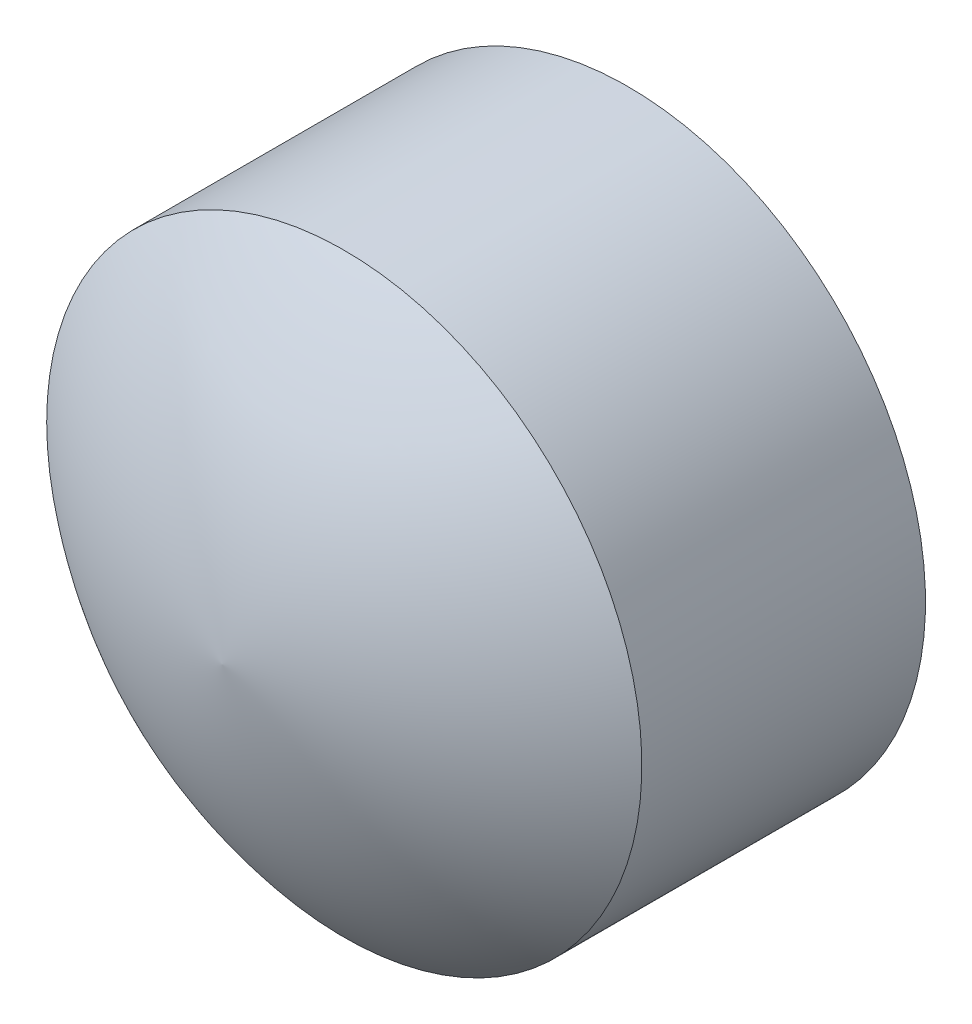
ISO-10303-21;
HEADER;
FILE_DESCRIPTION(('STEP AP214'),'2;1');
FILE_NAME('part.step','',(''),(''),'','','');
FILE_SCHEMA(('AUTOMOTIVE_DESIGN { 1 0 10303 214 1 1 1 1 }'));
ENDSEC;
DATA;
#1=APPLICATION_CONTEXT('core data for automotive mechanical design processes');
#2=APPLICATION_PROTOCOL_DEFINITION('international standard','automotive_design',2000,#1);
#3=PRODUCT_CONTEXT('',#1,'mechanical');
#4=PRODUCT('Part','Part','',(#3));
#5=PRODUCT_RELATED_PRODUCT_CATEGORY('part','',(#4));
#6=PRODUCT_DEFINITION_FORMATION('','',#4);
#7=PRODUCT_DEFINITION_CONTEXT('part definition',#1,'design');
#8=PRODUCT_DEFINITION('design','',#6,#7);
#9=PRODUCT_DEFINITION_SHAPE('','',#8);
#10=(LENGTH_UNIT() NAMED_UNIT(*) SI_UNIT(.MILLI.,.METRE.));
#11=(NAMED_UNIT(*) PLANE_ANGLE_UNIT() SI_UNIT($,.RADIAN.));
#12=(NAMED_UNIT(*) SI_UNIT($,.STERADIAN.) SOLID_ANGLE_UNIT());
#13=UNCERTAINTY_MEASURE_WITH_UNIT(LENGTH_MEASURE(1.E-05),#10,'distance_accuracy_value','');
#14=(GEOMETRIC_REPRESENTATION_CONTEXT(3) GLOBAL_UNCERTAINTY_ASSIGNED_CONTEXT((#13)) GLOBAL_UNIT_ASSIGNED_CONTEXT((#10,
#11,#12)) REPRESENTATION_CONTEXT('',''));
#15=CARTESIAN_POINT('',(0.,0.,0.));
#16=DIRECTION('',(0.,0.,1.));
#17=DIRECTION('',(1.,0.,0.));
#18=AXIS2_PLACEMENT_3D('',#15,#16,#17);
#19=CARTESIAN_POINT('',(0.,0.,0.));
#20=DIRECTION('',(0.,0.,1.));
#21=DIRECTION('',(1.,0.,0.));
#22=AXIS2_PLACEMENT_3D('',#19,#20,#21);
#23=PLANE('',#22);
#24=CARTESIAN_POINT('',(0.,0.,0.));
#25=DIRECTION('',(0.,0.,-1.));
#26=DIRECTION('',(-1.,0.,0.));
#27=AXIS2_PLACEMENT_3D('',#24,#25,#26);
#28=CIRCLE('',#27,6.);
#29=CARTESIAN_POINT('',(-6.,0.,0.));
#30=VERTEX_POINT('',#29);
#31=EDGE_CURVE('E11',#30,#30,#28,.T.);
#32=ORIENTED_EDGE('',*,*,#31,.T.);
#33=EDGE_LOOP('',(#32));
#34=FACE_BOUND('',#33,.T.);
#35=ADVANCED_FACE('F33',(#34),#23,.F.);
#36=CARTESIAN_POINT('',(0.,0.,0.));
#37=DIRECTION('',(0.,0.,-1.));
#38=DIRECTION('',(-1.,0.,0.));
#39=AXIS2_PLACEMENT_3D('',#36,#37,#38);
#40=CYLINDRICAL_SURFACE('',#39,6.);
#41=ORIENTED_EDGE('',*,*,#31,.F.);
#42=EDGE_LOOP('',(#41));
#43=FACE_BOUND('',#42,.T.);
#44=CARTESIAN_POINT('',(0.,0.,-10.));
#45=DIRECTION('',(0.,0.,-1.));
#46=DIRECTION('',(-1.,0.,0.));
#47=AXIS2_PLACEMENT_3D('',#44,#45,#46);
#48=CIRCLE('',#47,6.);
#49=CARTESIAN_POINT('',(-6.,0.,-10.));
#50=VERTEX_POINT('',#49);
#51=EDGE_CURVE('E39',#50,#50,#48,.T.);
#52=ORIENTED_EDGE('',*,*,#51,.T.);
#53=EDGE_LOOP('',(#52));
#54=FACE_BOUND('',#53,.T.);
#55=ADVANCED_FACE('F55',(#43,#54),#40,.F.);
#56=CARTESIAN_POINT('',(6.,0.,-10.));
#57=DIRECTION('',(0.,0.,1.));
#58=DIRECTION('',(1.,0.,0.));
#59=AXIS2_PLACEMENT_3D('',#56,#57,#58);
#60=PLANE('',#59);
#61=ORIENTED_EDGE('',*,*,#51,.F.);
#62=EDGE_LOOP('',(#61));
#63=FACE_BOUND('',#62,.T.);
#64=CARTESIAN_POINT('',(0.,0.,-10.));
#65=DIRECTION('',(0.,0.,-1.));
#66=DIRECTION('',(-1.,0.,0.));
#67=AXIS2_PLACEMENT_3D('',#64,#65,#66);
#68=CIRCLE('',#67,11.);
#69=CARTESIAN_POINT('',(-11.,0.,-10.));
#70=VERTEX_POINT('',#69);
#71=EDGE_CURVE('E66',#70,#70,#68,.T.);
#72=ORIENTED_EDGE('',*,*,#71,.T.);
#73=EDGE_LOOP('',(#72));
#74=FACE_BOUND('',#73,.T.);
#75=ADVANCED_FACE('F50',(#63,#74),#60,.F.);
#76=CARTESIAN_POINT('',(0.,0.,0.));
#77=DIRECTION('',(0.,0.,-1.));
#78=DIRECTION('',(-1.,0.,0.));
#79=AXIS2_PLACEMENT_3D('',#76,#77,#78);
#80=CYLINDRICAL_SURFACE('',#79,11.);
#81=ORIENTED_EDGE('',*,*,#71,.F.);
#82=EDGE_LOOP('',(#81));
#83=FACE_BOUND('',#82,.T.);
#84=CARTESIAN_POINT('',(0.,0.,0.485124968487665));
#85=DIRECTION('',(0.,0.,-1.));
#86=DIRECTION('',(-1.,0.,0.));
#87=AXIS2_PLACEMENT_3D('',#84,#85,#86);
#88=CIRCLE('',#87,11.);
#89=CARTESIAN_POINT('',(-11.,0.,0.485124968487666));
#90=VERTEX_POINT('',#89);
#91=EDGE_CURVE('E68',#90,#90,#88,.T.);
#92=ORIENTED_EDGE('',*,*,#91,.T.);
#93=EDGE_LOOP('',(#92));
#94=FACE_BOUND('',#93,.T.);
#95=ADVANCED_FACE('F44',(#83,#94),#80,.T.);
#96=CARTESIAN_POINT('',(1.75080006363017,0.,-14.9232200996022));
#97=DIRECTION('',(0.,-1.,0.));
#98=DIRECTION('',(-1.,0.,0.));
#99=AXIS2_PLACEMENT_3D('',#96,#97,#98);
#100=CIRCLE('',#99,20.);
#101=TRIMMED_CURVE('',#100,(PARAMETER_VALUE(-1.48314412943056)),
(PARAMETER_VALUE(1.48314412943056)),.T.,.PARAMETER.);
#102=CARTESIAN_POINT('',(0.,0.,-14.9232200996022));
#103=DIRECTION('',(0.,0.,-1.));
#104=AXIS1_PLACEMENT('',#102,#103);
#105=SURFACE_OF_REVOLUTION('',#101,#104);
#106=ORIENTED_EDGE('',*,*,#91,.F.);
#107=EDGE_LOOP('',(#106));
#108=FACE_BOUND('',#107,.T.);
#109=CARTESIAN_POINT('',(0.,0.,5.));
#110=VERTEX_POINT('',#109);
#111=VERTEX_LOOP('',#110);
#112=FACE_BOUND('',#111,.T.);
#113=ADVANCED_FACE('F42',(#108,#112),#105,.T.);
#114=CLOSED_SHELL('',(#35,#55,#75,#95,#113));
#115=MANIFOLD_SOLID_BREP('B2',#114);
#116=ADVANCED_BREP_SHAPE_REPRESENTATION('',(#18,#115),#14);
#117=SHAPE_DEFINITION_REPRESENTATION(#9,#116);
ENDSEC;
END-ISO-10303-21;
